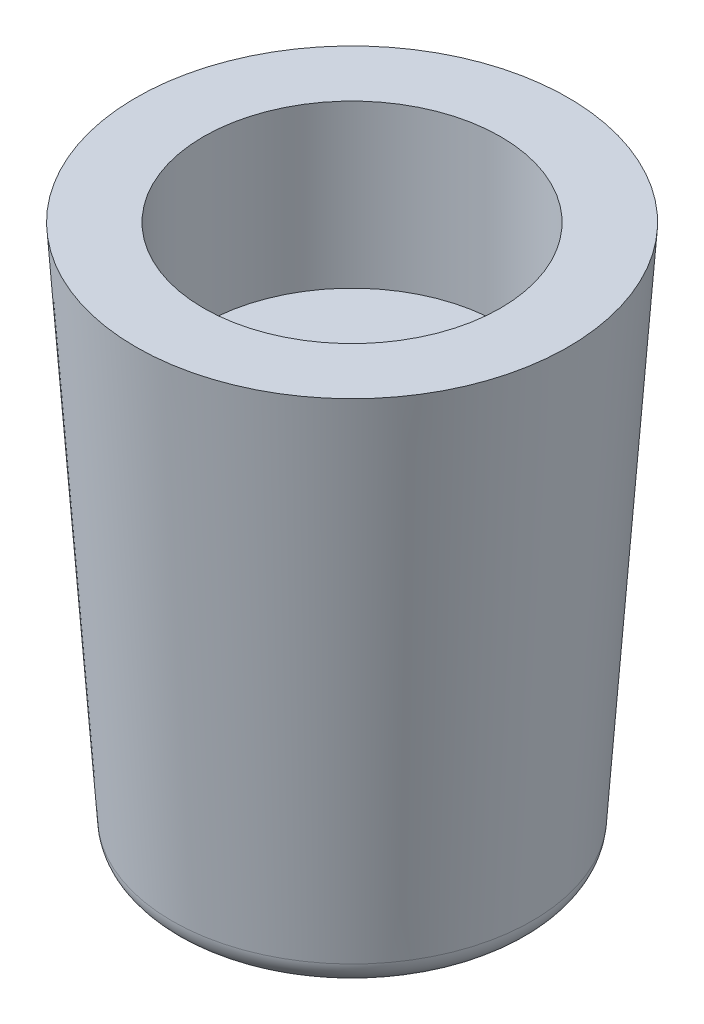
ISO-10303-21;
HEADER;
FILE_DESCRIPTION(('STEP AP214'),'2;1');
FILE_NAME('part.step','',(''),(''),'','','');
FILE_SCHEMA(('AUTOMOTIVE_DESIGN { 1 0 10303 214 1 1 1 1 }'));
ENDSEC;
DATA;
#1=APPLICATION_CONTEXT('core data for automotive mechanical design processes');
#2=APPLICATION_PROTOCOL_DEFINITION('international standard','automotive_design',2000,#1);
#3=PRODUCT_CONTEXT('',#1,'mechanical');
#4=PRODUCT('Part','Part','',(#3));
#5=PRODUCT_RELATED_PRODUCT_CATEGORY('part','',(#4));
#6=PRODUCT_DEFINITION_FORMATION('','',#4);
#7=PRODUCT_DEFINITION_CONTEXT('part definition',#1,'design');
#8=PRODUCT_DEFINITION('design','',#6,#7);
#9=PRODUCT_DEFINITION_SHAPE('','',#8);
#10=(LENGTH_UNIT() NAMED_UNIT(*) SI_UNIT(.MILLI.,.METRE.));
#11=(NAMED_UNIT(*) PLANE_ANGLE_UNIT() SI_UNIT($,.RADIAN.));
#12=(NAMED_UNIT(*) SI_UNIT($,.STERADIAN.) SOLID_ANGLE_UNIT());
#13=UNCERTAINTY_MEASURE_WITH_UNIT(LENGTH_MEASURE(1.E-05),#10,'distance_accuracy_value','');
#14=(GEOMETRIC_REPRESENTATION_CONTEXT(3) GLOBAL_UNCERTAINTY_ASSIGNED_CONTEXT((#13)) GLOBAL_UNIT_ASSIGNED_CONTEXT((#10,
#11,#12)) REPRESENTATION_CONTEXT('',''));
#15=CARTESIAN_POINT('',(0.,0.,0.));
#16=DIRECTION('',(0.,0.,1.));
#17=DIRECTION('',(1.,0.,0.));
#18=AXIS2_PLACEMENT_3D('',#15,#16,#17);
#19=CARTESIAN_POINT('',(0.,0.,0.));
#20=DIRECTION('',(0.,1.,0.));
#21=DIRECTION('',(0.,0.,1.));
#22=AXIS2_PLACEMENT_3D('',#19,#20,#21);
#23=CONICAL_SURFACE('',#22,4.,0.0698131700797732);
#24=CARTESIAN_POINT('',(0.,-9.53487823687206,0.));
#25=DIRECTION('',(0.,1.,0.));
#26=DIRECTION('',(0.,0.,1.));
#27=AXIS2_PLACEMENT_3D('',#24,#25,#26);
#28=CIRCLE('',#27,3.33325636262598);
#29=CARTESIAN_POINT('',(0.,-9.53487823687206,3.33325636262598));
#30=VERTEX_POINT('',#29);
#31=EDGE_CURVE('E53',#30,#30,#28,.T.);
#32=ORIENTED_EDGE('',*,*,#31,.T.);
#33=EDGE_LOOP('',(#32));
#34=FACE_BOUND('',#33,.T.);
#35=CARTESIAN_POINT('',(0.,0.,0.));
#36=DIRECTION('',(0.,1.,0.));
#37=DIRECTION('',(0.,0.,1.));
#38=AXIS2_PLACEMENT_3D('',#35,#36,#37);
#39=CIRCLE('',#38,4.);
#40=CARTESIAN_POINT('',(0.,0.,4.));
#41=VERTEX_POINT('',#40);
#42=EDGE_CURVE('E58',#41,#41,#39,.T.);
#43=ORIENTED_EDGE('',*,*,#42,.F.);
#44=EDGE_LOOP('',(#43));
#45=FACE_BOUND('',#44,.T.);
#46=ADVANCED_FACE('F45',(#34,#45),#23,.T.);
#47=CARTESIAN_POINT('',(0.,-10.,0.));
#48=DIRECTION('',(0.,1.,0.));
#49=DIRECTION('',(0.,0.,1.));
#50=AXIS2_PLACEMENT_3D('',#47,#48,#49);
#51=PLANE('',#50);
#52=CARTESIAN_POINT('',(0.,-10.,0.));
#53=DIRECTION('',(0.,1.,0.));
#54=DIRECTION('',(0.,0.,1.));
#55=AXIS2_PLACEMENT_3D('',#52,#53,#54);
#56=CIRCLE('',#55,2.83447433749606);
#57=CARTESIAN_POINT('',(0.,-10.,2.83447433749606));
#58=VERTEX_POINT('',#57);
#59=EDGE_CURVE('E10',#58,#58,#56,.F.);
#60=ORIENTED_EDGE('',*,*,#59,.T.);
#61=EDGE_LOOP('',(#60));
#62=FACE_BOUND('',#61,.T.);
#63=ADVANCED_FACE('F86',(#62),#51,.F.);
#64=CARTESIAN_POINT('',(0.,0.,0.));
#65=DIRECTION('',(0.,1.,0.));
#66=DIRECTION('',(0.,0.,1.));
#67=AXIS2_PLACEMENT_3D('',#64,#65,#66);
#68=PLANE('',#67);
#69=CARTESIAN_POINT('',(0.,0.,0.));
#70=DIRECTION('',(0.,1.,0.));
#71=DIRECTION('',(0.,0.,1.));
#72=AXIS2_PLACEMENT_3D('',#69,#70,#71);
#73=CIRCLE('',#72,2.75);
#74=CARTESIAN_POINT('',(0.,0.,-2.75));
#75=VERTEX_POINT('',#74);
#76=EDGE_CURVE('E63',#75,#75,#73,.F.);
#77=ORIENTED_EDGE('',*,*,#76,.T.);
#78=EDGE_LOOP('',(#77));
#79=FACE_BOUND('',#78,.T.);
#80=ORIENTED_EDGE('',*,*,#42,.T.);
#81=EDGE_LOOP('',(#80));
#82=FACE_BOUND('',#81,.T.);
#83=ADVANCED_FACE('F78',(#79,#82),#68,.T.);
#84=CARTESIAN_POINT('',(0.,1.2E-05,0.));
#85=DIRECTION('',(0.,-1.,0.));
#86=DIRECTION('',(0.,0.,-1.));
#87=AXIS2_PLACEMENT_3D('',#84,#85,#86);
#88=CYLINDRICAL_SURFACE('',#87,2.75);
#89=CARTESIAN_POINT('',(0.,-3.,0.));
#90=DIRECTION('',(0.,1.,0.));
#91=DIRECTION('',(0.,0.,1.));
#92=AXIS2_PLACEMENT_3D('',#89,#90,#91);
#93=CIRCLE('',#92,2.75);
#94=CARTESIAN_POINT('',(0.,-3.,-2.75));
#95=VERTEX_POINT('',#94);
#96=EDGE_CURVE('E68',#95,#95,#93,.T.);
#97=CARTESIAN_POINT('',(0.,0.,-2.75));
#98=CARTESIAN_POINT('',(0.,-0.03125,-2.75));
#99=CARTESIAN_POINT('',(0.,-0.0625,-2.75));
#100=CARTESIAN_POINT('',(0.,-0.125,-2.75));
#101=CARTESIAN_POINT('',(0.,-0.15625,-2.75));
#102=CARTESIAN_POINT('',(0.,-0.21875,-2.75));
#103=CARTESIAN_POINT('',(0.,-0.25,-2.75));
#104=CARTESIAN_POINT('',(0.,-0.3125,-2.75));
#105=CARTESIAN_POINT('',(0.,-0.34375,-2.75));
#106=CARTESIAN_POINT('',(0.,-0.40625,-2.75));
#107=CARTESIAN_POINT('',(0.,-0.4375,-2.75));
#108=CARTESIAN_POINT('',(0.,-0.5,-2.75));
#109=CARTESIAN_POINT('',(0.,-0.53125,-2.75));
#110=CARTESIAN_POINT('',(0.,-0.59375,-2.75));
#111=CARTESIAN_POINT('',(0.,-0.625,-2.75));
#112=CARTESIAN_POINT('',(0.,-0.6875,-2.75));
#113=CARTESIAN_POINT('',(0.,-0.71875,-2.75));
#114=CARTESIAN_POINT('',(0.,-0.78125,-2.75));
#115=CARTESIAN_POINT('',(0.,-0.8125,-2.75));
#116=CARTESIAN_POINT('',(0.,-0.875,-2.75));
#117=CARTESIAN_POINT('',(0.,-0.90625,-2.75));
#118=CARTESIAN_POINT('',(0.,-0.96875,-2.75));
#119=CARTESIAN_POINT('',(0.,-1.,-2.75));
#120=CARTESIAN_POINT('',(0.,-1.0625,-2.75));
#121=CARTESIAN_POINT('',(0.,-1.09375,-2.75));
#122=CARTESIAN_POINT('',(0.,-1.15625,-2.75));
#123=CARTESIAN_POINT('',(0.,-1.1875,-2.75));
#124=CARTESIAN_POINT('',(0.,-1.25,-2.75));
#125=CARTESIAN_POINT('',(0.,-1.28125,-2.75));
#126=CARTESIAN_POINT('',(0.,-1.34375,-2.75));
#127=CARTESIAN_POINT('',(0.,-1.375,-2.75));
#128=CARTESIAN_POINT('',(0.,-1.4375,-2.75));
#129=CARTESIAN_POINT('',(0.,-1.46875,-2.75));
#130=CARTESIAN_POINT('',(0.,-1.53125,-2.75));
#131=CARTESIAN_POINT('',(0.,-1.5625,-2.75));
#132=CARTESIAN_POINT('',(0.,-1.625,-2.75));
#133=CARTESIAN_POINT('',(0.,-1.65625,-2.75));
#134=CARTESIAN_POINT('',(0.,-1.71875,-2.75));
#135=CARTESIAN_POINT('',(0.,-1.75,-2.75));
#136=CARTESIAN_POINT('',(0.,-1.8125,-2.75));
#137=CARTESIAN_POINT('',(0.,-1.84375,-2.75));
#138=CARTESIAN_POINT('',(0.,-1.90625,-2.75));
#139=CARTESIAN_POINT('',(0.,-1.9375,-2.75));
#140=CARTESIAN_POINT('',(0.,-2.,-2.75));
#141=CARTESIAN_POINT('',(0.,-2.03125,-2.75));
#142=CARTESIAN_POINT('',(0.,-2.09375,-2.75));
#143=CARTESIAN_POINT('',(0.,-2.125,-2.75));
#144=CARTESIAN_POINT('',(0.,-2.1875,-2.75));
#145=CARTESIAN_POINT('',(0.,-2.21875,-2.75));
#146=CARTESIAN_POINT('',(0.,-2.28125,-2.75));
#147=CARTESIAN_POINT('',(0.,-2.3125,-2.75));
#148=CARTESIAN_POINT('',(0.,-2.375,-2.75));
#149=CARTESIAN_POINT('',(0.,-2.40625,-2.75));
#150=CARTESIAN_POINT('',(0.,-2.46875,-2.75));
#151=CARTESIAN_POINT('',(0.,-2.5,-2.75));
#152=CARTESIAN_POINT('',(0.,-2.5625,-2.75));
#153=CARTESIAN_POINT('',(0.,-2.59375,-2.75));
#154=CARTESIAN_POINT('',(0.,-2.65625,-2.75));
#155=CARTESIAN_POINT('',(0.,-2.6875,-2.75));
#156=CARTESIAN_POINT('',(0.,-2.75,-2.75));
#157=CARTESIAN_POINT('',(0.,-2.78125,-2.75));
#158=CARTESIAN_POINT('',(0.,-2.84375,-2.75));
#159=CARTESIAN_POINT('',(0.,-2.875,-2.75));
#160=CARTESIAN_POINT('',(0.,-2.9375,-2.75));
#161=CARTESIAN_POINT('',(0.,-2.96875,-2.75));
#162=CARTESIAN_POINT('',(0.,-3.,-2.75));
#163=B_SPLINE_CURVE_WITH_KNOTS('',3,(#97,#98,#99,#100,#101,#102,#103,#104,#105,#106,#107,#108,
#109,#110,#111,#112,#113,#114,#115,#116,#117,#118,#119,#120,#121,#122,#123,#124,#125,#126,#127,
#128,#129,#130,#131,#132,#133,#134,#135,#136,#137,#138,#139,#140,#141,#142,#143,#144,#145,#146,
#147,#148,#149,#150,#151,#152,#153,#154,#155,#156,#157,#158,#159,#160,#161,#162),.UNSPECIFIED.,
.F.,.F.,(4,2,2,2,2,2,2,2,2,2,2,2,2,2,2,2,2,2,2,2,2,2,2,2,2,2,2,2,2,2,2,2,4),(0.,0.09375,0.1875,
0.28125,0.375,0.46875,0.5625,0.65625,0.75,0.84375,0.9375,1.03125,1.125,1.21875,1.3125,1.40625,
1.5,1.59375,1.6875,1.78125,1.875,1.96875,2.0625,2.15625,2.25,2.34375,2.4375,2.53125,2.625,
2.71875,2.8125,2.90625,3.),.UNSPECIFIED.);
#164=EDGE_CURVE('BSEAM76',#75,#95,#163,.T.);
#165=ORIENTED_EDGE('',*,*,#76,.F.);
#166=ORIENTED_EDGE('',*,*,#96,.F.);
#167=ORIENTED_EDGE('',*,*,#164,.T.);
#168=ORIENTED_EDGE('',*,*,#164,.F.);
#169=EDGE_LOOP('',(#165,#167,#166,#168));
#170=FACE_BOUND('',#169,.T.);
#171=ADVANCED_FACE('F76',(#170),#88,.F.);
#172=CARTESIAN_POINT('',(0.,-3.,0.));
#173=DIRECTION('',(0.,1.,0.));
#174=DIRECTION('',(0.,0.,1.));
#175=AXIS2_PLACEMENT_3D('',#172,#173,#174);
#176=PLANE('',#175);
#177=ORIENTED_EDGE('',*,*,#96,.T.);
#178=EDGE_LOOP('',(#177));
#179=FACE_BOUND('',#178,.T.);
#180=ADVANCED_FACE('F74',(#179),#176,.T.);
#181=CARTESIAN_POINT('',(0.,-9.5,0.));
#182=DIRECTION('',(0.,1.,0.));
#183=DIRECTION('',(0.,0.,1.));
#184=AXIS2_PLACEMENT_3D('',#181,#182,#183);
#185=TOROIDAL_SURFACE('',#184,2.83447433749606,0.5);
#186=ORIENTED_EDGE('',*,*,#59,.F.);
#187=EDGE_LOOP('',(#186));
#188=FACE_BOUND('',#187,.T.);
#189=ORIENTED_EDGE('',*,*,#31,.F.);
#190=EDGE_LOOP('',(#189));
#191=FACE_BOUND('',#190,.T.);
#192=ADVANCED_FACE('F47',(#188,#191),#185,.T.);
#193=CLOSED_SHELL('',(#46,#63,#83,#171,#180,#192));
#194=MANIFOLD_SOLID_BREP('B2',#193);
#195=ADVANCED_BREP_SHAPE_REPRESENTATION('',(#18,#194),#14);
#196=SHAPE_DEFINITION_REPRESENTATION(#9,#195);
ENDSEC;
END-ISO-10303-21;
